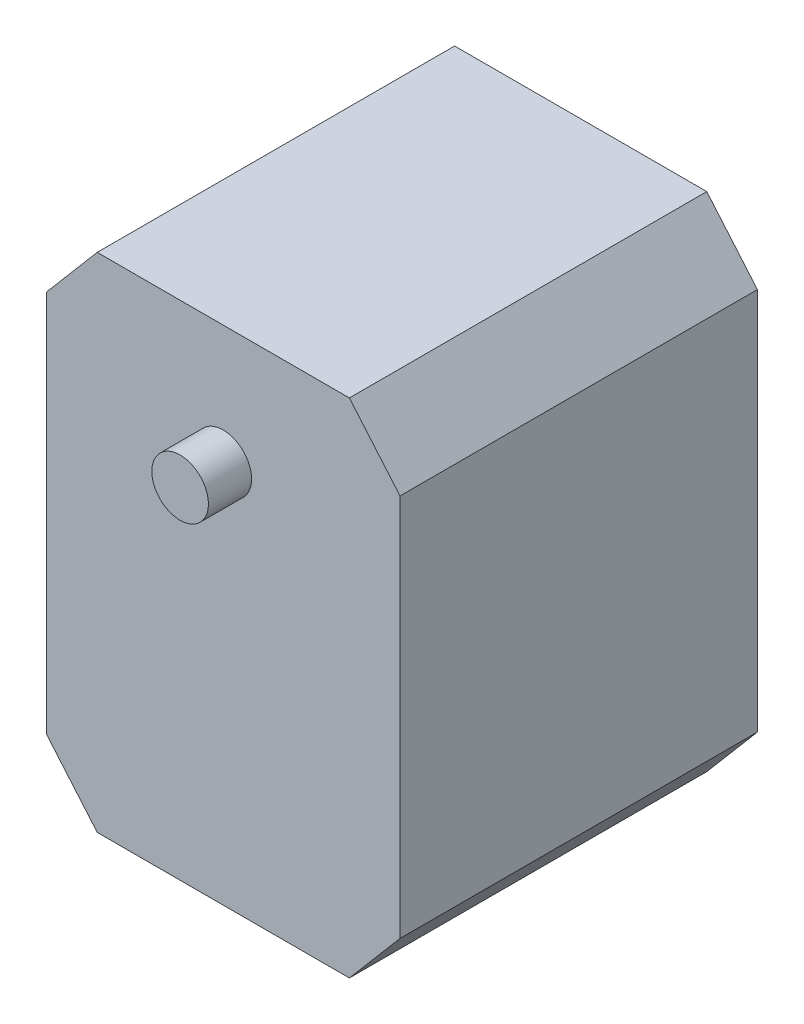
ISO-10303-21;
HEADER;
FILE_DESCRIPTION(('STEP AP214'),'2;1');
FILE_NAME('part.step','',(''),(''),'','','');
FILE_SCHEMA(('AUTOMOTIVE_DESIGN { 1 0 10303 214 1 1 1 1 }'));
ENDSEC;
DATA;
#1=APPLICATION_CONTEXT('core data for automotive mechanical design processes');
#2=APPLICATION_PROTOCOL_DEFINITION('international standard','automotive_design',2000,#1);
#3=PRODUCT_CONTEXT('',#1,'mechanical');
#4=PRODUCT('Part','Part','',(#3));
#5=PRODUCT_RELATED_PRODUCT_CATEGORY('part','',(#4));
#6=PRODUCT_DEFINITION_FORMATION('','',#4);
#7=PRODUCT_DEFINITION_CONTEXT('part definition',#1,'design');
#8=PRODUCT_DEFINITION('design','',#6,#7);
#9=PRODUCT_DEFINITION_SHAPE('','',#8);
#10=(LENGTH_UNIT() NAMED_UNIT(*) SI_UNIT(.MILLI.,.METRE.));
#11=(NAMED_UNIT(*) PLANE_ANGLE_UNIT() SI_UNIT($,.RADIAN.));
#12=(NAMED_UNIT(*) SI_UNIT($,.STERADIAN.) SOLID_ANGLE_UNIT());
#13=UNCERTAINTY_MEASURE_WITH_UNIT(LENGTH_MEASURE(1.E-05),#10,'distance_accuracy_value','');
#14=(GEOMETRIC_REPRESENTATION_CONTEXT(3) GLOBAL_UNCERTAINTY_ASSIGNED_CONTEXT((#13)) GLOBAL_UNIT_ASSIGNED_CONTEXT((#10,
#11,#12)) REPRESENTATION_CONTEXT('',''));
#15=CARTESIAN_POINT('',(0.,0.,0.));
#16=DIRECTION('',(0.,0.,1.));
#17=DIRECTION('',(1.,0.,0.));
#18=AXIS2_PLACEMENT_3D('',#15,#16,#17);
#19=CARTESIAN_POINT('',(0.,0.,-17.75));
#20=DIRECTION('',(0.,0.,1.));
#21=DIRECTION('',(1.,0.,0.));
#22=AXIS2_PLACEMENT_3D('',#19,#20,#21);
#23=PLANE('',#22);
#24=CARTESIAN_POINT('',(0.,0.,-17.75));
#25=DIRECTION('',(0.,0.,1.));
#26=DIRECTION('',(1.,0.,0.));
#27=AXIS2_PLACEMENT_3D('',#24,#25,#26);
#28=CIRCLE('',#27,1.6);
#29=CARTESIAN_POINT('',(1.6,0.,-17.75));
#30=VERTEX_POINT('',#29);
#31=EDGE_CURVE('E11',#30,#30,#28,.F.);
#32=ORIENTED_EDGE('',*,*,#31,.T.);
#33=EDGE_LOOP('',(#32));
#34=FACE_BOUND('',#33,.T.);
#35=ADVANCED_FACE('F37',(#34),#23,.F.);
#36=CARTESIAN_POINT('',(0.,0.,-20.2125));
#37=DIRECTION('',(0.,0.,1.));
#38=DIRECTION('',(1.,0.,0.));
#39=AXIS2_PLACEMENT_3D('',#36,#37,#38);
#40=CYLINDRICAL_SURFACE('',#39,1.6);
#41=CARTESIAN_POINT('',(0.,0.,-19.25));
#42=DIRECTION('',(0.,0.,1.));
#43=DIRECTION('',(1.,0.,0.));
#44=AXIS2_PLACEMENT_3D('',#41,#42,#43);
#45=CIRCLE('',#44,1.6);
#46=CARTESIAN_POINT('',(1.6,0.,-19.25));
#47=VERTEX_POINT('',#46);
#48=EDGE_CURVE('E162',#47,#47,#45,.T.);
#49=ORIENTED_EDGE('',*,*,#48,.F.);
#50=EDGE_LOOP('',(#49));
#51=FACE_BOUND('',#50,.T.);
#52=ORIENTED_EDGE('',*,*,#31,.F.);
#53=EDGE_LOOP('',(#52));
#54=FACE_BOUND('',#53,.T.);
#55=ADVANCED_FACE('F39',(#51,#54),#40,.F.);
#56=CARTESIAN_POINT('',(0.,0.,0.9625));
#57=DIRECTION('',(0.,0.,-1.));
#58=DIRECTION('',(-1.,0.,0.));
#59=AXIS2_PLACEMENT_3D('',#56,#57,#58);
#60=CYLINDRICAL_SURFACE('',#59,3.);
#61=CARTESIAN_POINT('',(0.,0.,-19.25));
#62=DIRECTION('',(0.,0.,-1.));
#63=DIRECTION('',(-1.,0.,0.));
#64=AXIS2_PLACEMENT_3D('',#61,#62,#63);
#65=CIRCLE('',#64,3.);
#66=CARTESIAN_POINT('',(-3.,0.,-19.25));
#67=VERTEX_POINT('',#66);
#68=EDGE_CURVE('E119',#67,#67,#65,.F.);
#69=ORIENTED_EDGE('',*,*,#68,.T.);
#70=EDGE_LOOP('',(#69));
#71=FACE_BOUND('',#70,.T.);
#72=CARTESIAN_POINT('',(0.,0.,-17.75));
#73=DIRECTION('',(0.,0.,1.));
#74=DIRECTION('',(1.,0.,0.));
#75=AXIS2_PLACEMENT_3D('',#72,#73,#74);
#76=CIRCLE('',#75,3.);
#77=CARTESIAN_POINT('',(3.,0.,-17.75));
#78=VERTEX_POINT('',#77);
#79=EDGE_CURVE('E138',#78,#78,#76,.F.);
#80=ORIENTED_EDGE('',*,*,#79,.T.);
#81=EDGE_LOOP('',(#80));
#82=FACE_BOUND('',#81,.T.);
#83=ADVANCED_FACE('F202',(#71,#82),#60,.T.);
#84=CARTESIAN_POINT('',(0.,0.,-19.25));
#85=DIRECTION('',(0.,0.,-1.));
#86=DIRECTION('',(-1.,0.,0.));
#87=AXIS2_PLACEMENT_3D('',#84,#85,#86);
#88=PLANE('',#87);
#89=ORIENTED_EDGE('',*,*,#48,.T.);
#90=EDGE_LOOP('',(#89));
#91=FACE_BOUND('',#90,.T.);
#92=ORIENTED_EDGE('',*,*,#68,.F.);
#93=EDGE_LOOP('',(#92));
#94=FACE_BOUND('',#93,.T.);
#95=ADVANCED_FACE('F197',(#91,#94),#88,.T.);
#96=DIRECTION('',(1.,-1.90121568558025E-12,0.));
#97=VECTOR('',#96,1.);
#98=CARTESIAN_POINT('',(-6.22665484517751,12.0000000000011,-17.75));
#99=LINE('',#98,#97);
#100=CARTESIAN_POINT('',(-12.7,12.,-17.75));
#101=VERTEX_POINT('',#100);
#102=CARTESIAN_POINT('',(12.7,12.,-17.75));
#103=VERTEX_POINT('',#102);
#104=EDGE_CURVE('E157',#101,#103,#99,.T.);
#105=ORIENTED_EDGE('',*,*,#104,.T.);
#106=DIRECTION('',(0.647648420095541,-0.761939317759459,0.));
#107=VECTOR('',#106,1.);
#108=CARTESIAN_POINT('',(17.8,6.,-17.75));
#109=LINE('',#108,#107);
#110=CARTESIAN_POINT('',(17.8,6.,-17.75));
#111=VERTEX_POINT('',#110);
#112=EDGE_CURVE('E139',#103,#111,#109,.T.);
#113=ORIENTED_EDGE('',*,*,#112,.T.);
#114=DIRECTION('',(0.,-1.,0.));
#115=VECTOR('',#114,1.);
#116=CARTESIAN_POINT('',(17.8,-32.6,-17.75));
#117=LINE('',#116,#115);
#118=CARTESIAN_POINT('',(17.8,-32.6,-17.75));
#119=VERTEX_POINT('',#118);
#120=EDGE_CURVE('E142',#111,#119,#117,.T.);
#121=ORIENTED_EDGE('',*,*,#120,.T.);
#122=DIRECTION('',(-0.647648420095541,-0.761939317759459,0.));
#123=VECTOR('',#122,1.);
#124=CARTESIAN_POINT('',(12.7,-38.6,-17.75));
#125=LINE('',#124,#123);
#126=CARTESIAN_POINT('',(12.7,-38.6,-17.75));
#127=VERTEX_POINT('',#126);
#128=EDGE_CURVE('E145',#119,#127,#125,.T.);
#129=ORIENTED_EDGE('',*,*,#128,.T.);
#130=DIRECTION('',(-1.,0.,0.));
#131=VECTOR('',#130,1.);
#132=CARTESIAN_POINT('',(-12.7,-38.6,-17.75));
#133=LINE('',#132,#131);
#134=CARTESIAN_POINT('',(-12.7,-38.6,-17.75));
#135=VERTEX_POINT('',#134);
#136=EDGE_CURVE('E148',#127,#135,#133,.T.);
#137=ORIENTED_EDGE('',*,*,#136,.T.);
#138=DIRECTION('',(-0.647648420095541,0.761939317759459,0.));
#139=VECTOR('',#138,1.);
#140=CARTESIAN_POINT('',(-17.8,-32.6,-17.75));
#141=LINE('',#140,#139);
#142=CARTESIAN_POINT('',(-17.8,-32.6,-17.75));
#143=VERTEX_POINT('',#142);
#144=EDGE_CURVE('E151',#135,#143,#141,.T.);
#145=ORIENTED_EDGE('',*,*,#144,.T.);
#146=DIRECTION('',(0.,1.,0.));
#147=VECTOR('',#146,1.);
#148=CARTESIAN_POINT('',(-17.7999999999999,5.9999999999999,-17.75));
#149=LINE('',#148,#147);
#150=CARTESIAN_POINT('',(-17.7999999999999,5.9999999999999,-17.75));
#151=VERTEX_POINT('',#150);
#152=EDGE_CURVE('E113',#143,#151,#149,.T.);
#153=ORIENTED_EDGE('',*,*,#152,.T.);
#154=DIRECTION('',(0.647648420095526,0.761939317759472,0.));
#155=VECTOR('',#154,1.);
#156=CARTESIAN_POINT('',(-12.7,12.,-17.75));
#157=LINE('',#156,#155);
#158=EDGE_CURVE('E154',#151,#101,#157,.T.);
#159=ORIENTED_EDGE('',*,*,#158,.T.);
#160=EDGE_LOOP('',(#105,#113,#121,#129,#137,#145,#153,#159));
#161=FACE_BOUND('',#160,.T.);
#162=ORIENTED_EDGE('',*,*,#79,.F.);
#163=EDGE_LOOP('',(#162));
#164=FACE_BOUND('',#163,.T.);
#165=ADVANCED_FACE('F207',(#161,#164),#23,.F.);
#166=CARTESIAN_POINT('',(12.2,12.,-17.75));
#167=DIRECTION('',(0.,1.,0.));
#168=DIRECTION('',(0.,0.,1.));
#169=AXIS2_PLACEMENT_3D('',#166,#167,#168);
#170=PLANE('',#169);
#171=ORIENTED_EDGE('',*,*,#104,.F.);
#172=DIRECTION('',(0.,0.,1.));
#173=VECTOR('',#172,1.);
#174=CARTESIAN_POINT('',(-12.7,12.,-17.75));
#175=LINE('',#174,#173);
#176=CARTESIAN_POINT('',(-12.7,12.,18.25));
#177=VERTEX_POINT('',#176);
#178=EDGE_CURVE('E55',#101,#177,#175,.T.);
#179=ORIENTED_EDGE('',*,*,#178,.T.);
#180=DIRECTION('',(1.,0.,0.));
#181=VECTOR('',#180,1.);
#182=CARTESIAN_POINT('',(5.65,12.,18.25));
#183=LINE('',#182,#181);
#184=CARTESIAN_POINT('',(12.7,12.,18.25));
#185=VERTEX_POINT('',#184);
#186=EDGE_CURVE('E160',#177,#185,#183,.T.);
#187=ORIENTED_EDGE('',*,*,#186,.T.);
#188=DIRECTION('',(0.,0.,1.));
#189=VECTOR('',#188,1.);
#190=CARTESIAN_POINT('',(12.7,12.,-17.75));
#191=LINE('',#190,#189);
#192=EDGE_CURVE('E95',#185,#103,#191,.F.);
#193=ORIENTED_EDGE('',*,*,#192,.T.);
#194=EDGE_LOOP('',(#171,#179,#187,#193));
#195=FACE_BOUND('',#194,.T.);
#196=ADVANCED_FACE('F214',(#195),#170,.T.);
#197=CARTESIAN_POINT('',(17.8,-32.6,13.));
#198=DIRECTION('',(1.,0.,0.));
#199=DIRECTION('',(0.,0.,-1.));
#200=AXIS2_PLACEMENT_3D('',#197,#198,#199);
#201=PLANE('',#200);
#202=DIRECTION('',(0.,0.,1.));
#203=VECTOR('',#202,1.);
#204=CARTESIAN_POINT('',(17.8,6.,-13.));
#205=LINE('',#204,#203);
#206=CARTESIAN_POINT('',(17.8,6.,18.25));
#207=VERTEX_POINT('',#206);
#208=EDGE_CURVE('E169',#111,#207,#205,.T.);
#209=ORIENTED_EDGE('',*,*,#208,.T.);
#210=DIRECTION('',(0.,-1.,0.));
#211=VECTOR('',#210,1.);
#212=CARTESIAN_POINT('',(17.8,-32.6,18.25));
#213=LINE('',#212,#211);
#214=CARTESIAN_POINT('',(17.8,-32.6,18.25));
#215=VERTEX_POINT('',#214);
#216=EDGE_CURVE('E499',#207,#215,#213,.T.);
#217=ORIENTED_EDGE('',*,*,#216,.T.);
#218=DIRECTION('',(0.,0.,-1.));
#219=VECTOR('',#218,1.);
#220=CARTESIAN_POINT('',(17.8,-32.6,13.));
#221=LINE('',#220,#219);
#222=EDGE_CURVE('E172',#215,#119,#221,.T.);
#223=ORIENTED_EDGE('',*,*,#222,.T.);
#224=ORIENTED_EDGE('',*,*,#120,.F.);
#225=EDGE_LOOP('',(#209,#217,#223,#224));
#226=FACE_BOUND('',#225,.T.);
#227=ADVANCED_FACE('F219',(#226),#201,.T.);
#228=CARTESIAN_POINT('',(12.7,-38.6,13.));
#229=DIRECTION('',(0.761939317759496,-0.647648420095497,0.));
#230=DIRECTION('',(0.647648420095497,0.761939317759496,0.));
#231=AXIS2_PLACEMENT_3D('',#228,#229,#230);
#232=PLANE('',#231);
#233=ORIENTED_EDGE('',*,*,#128,.F.);
#234=ORIENTED_EDGE('',*,*,#222,.F.);
#235=DIRECTION('',(-0.647648420095541,-0.761939317759459,0.));
#236=VECTOR('',#235,1.);
#237=CARTESIAN_POINT('',(12.7,-38.6,18.25));
#238=LINE('',#237,#236);
#239=CARTESIAN_POINT('',(12.7,-38.6,18.25));
#240=VERTEX_POINT('',#239);
#241=EDGE_CURVE('E133',#215,#240,#238,.T.);
#242=ORIENTED_EDGE('',*,*,#241,.T.);
#243=DIRECTION('',(0.,0.,1.));
#244=VECTOR('',#243,1.);
#245=CARTESIAN_POINT('',(12.7,-38.6,13.));
#246=LINE('',#245,#244);
#247=EDGE_CURVE('E174',#240,#127,#246,.F.);
#248=ORIENTED_EDGE('',*,*,#247,.T.);
#249=EDGE_LOOP('',(#233,#234,#242,#248));
#250=FACE_BOUND('',#249,.T.);
#251=ADVANCED_FACE('F254',(#250),#232,.T.);
#252=CARTESIAN_POINT('',(-12.7,-38.6,13.));
#253=DIRECTION('',(0.,-1.,0.));
#254=DIRECTION('',(0.,0.,-1.));
#255=AXIS2_PLACEMENT_3D('',#252,#253,#254);
#256=PLANE('',#255);
#257=ORIENTED_EDGE('',*,*,#136,.F.);
#258=ORIENTED_EDGE('',*,*,#247,.F.);
#259=DIRECTION('',(-1.,0.,0.));
#260=VECTOR('',#259,1.);
#261=CARTESIAN_POINT('',(-12.7,-38.6,18.25));
#262=LINE('',#261,#260);
#263=CARTESIAN_POINT('',(-12.7,-38.6,18.25));
#264=VERTEX_POINT('',#263);
#265=EDGE_CURVE('E131',#240,#264,#262,.T.);
#266=ORIENTED_EDGE('',*,*,#265,.T.);
#267=DIRECTION('',(0.,0.,-1.));
#268=VECTOR('',#267,1.);
#269=CARTESIAN_POINT('',(-12.7,-38.6,13.));
#270=LINE('',#269,#268);
#271=EDGE_CURVE('E118',#264,#135,#270,.T.);
#272=ORIENTED_EDGE('',*,*,#271,.T.);
#273=EDGE_LOOP('',(#257,#258,#266,#272));
#274=FACE_BOUND('',#273,.T.);
#275=ADVANCED_FACE('F265',(#274),#256,.T.);
#276=CARTESIAN_POINT('',(-17.8,-32.6,13.));
#277=DIRECTION('',(-0.761939317759496,-0.647648420095497,0.));
#278=DIRECTION('',(0.647648420095497,-0.761939317759496,0.));
#279=AXIS2_PLACEMENT_3D('',#276,#277,#278);
#280=PLANE('',#279);
#281=DIRECTION('',(0.,0.,1.));
#282=VECTOR('',#281,1.);
#283=CARTESIAN_POINT('',(-17.8,-32.6,13.));
#284=LINE('',#283,#282);
#285=CARTESIAN_POINT('',(-17.8,-32.6,18.25));
#286=VERTEX_POINT('',#285);
#287=EDGE_CURVE('E108',#286,#143,#284,.F.);
#288=ORIENTED_EDGE('',*,*,#287,.T.);
#289=ORIENTED_EDGE('',*,*,#144,.F.);
#290=ORIENTED_EDGE('',*,*,#271,.F.);
#291=DIRECTION('',(-0.647648420095541,0.761939317759459,0.));
#292=VECTOR('',#291,1.);
#293=CARTESIAN_POINT('',(-17.8,-32.6,18.25));
#294=LINE('',#293,#292);
#295=EDGE_CURVE('E126',#264,#286,#294,.T.);
#296=ORIENTED_EDGE('',*,*,#295,.T.);
#297=EDGE_LOOP('',(#288,#289,#290,#296));
#298=FACE_BOUND('',#297,.T.);
#299=ADVANCED_FACE('F130',(#298),#280,.T.);
#300=CARTESIAN_POINT('',(-17.8,6.,13.));
#301=DIRECTION('',(-1.,0.,0.));
#302=DIRECTION('',(0.,0.,1.));
#303=AXIS2_PLACEMENT_3D('',#300,#301,#302);
#304=PLANE('',#303);
#305=ORIENTED_EDGE('',*,*,#152,.F.);
#306=ORIENTED_EDGE('',*,*,#287,.F.);
#307=DIRECTION('',(0.,1.,0.));
#308=VECTOR('',#307,1.);
#309=CARTESIAN_POINT('',(-17.7999999999999,5.9999999999999,18.25));
#310=LINE('',#309,#308);
#311=CARTESIAN_POINT('',(-17.7999999999999,5.9999999999999,18.25));
#312=VERTEX_POINT('',#311);
#313=EDGE_CURVE('E111',#286,#312,#310,.T.);
#314=ORIENTED_EDGE('',*,*,#313,.T.);
#315=DIRECTION('',(0.,0.,1.));
#316=VECTOR('',#315,1.);
#317=CARTESIAN_POINT('',(-17.7999999999997,5.99999999999971,13.));
#318=LINE('',#317,#316);
#319=EDGE_CURVE('E84',#151,#312,#318,.T.);
#320=ORIENTED_EDGE('',*,*,#319,.F.);
#321=EDGE_LOOP('',(#305,#306,#314,#320));
#322=FACE_BOUND('',#321,.T.);
#323=ADVANCED_FACE('F110',(#322),#304,.T.);
#324=CARTESIAN_POINT('',(-12.7,12.,13.));
#325=DIRECTION('',(-0.761939317759496,0.647648420095497,0.));
#326=DIRECTION('',(-0.647648420095497,-0.761939317759496,0.));
#327=AXIS2_PLACEMENT_3D('',#324,#325,#326);
#328=PLANE('',#327);
#329=ORIENTED_EDGE('',*,*,#158,.F.);
#330=ORIENTED_EDGE('',*,*,#319,.T.);
#331=DIRECTION('',(0.647648420095526,0.761939317759472,0.));
#332=VECTOR('',#331,1.);
#333=CARTESIAN_POINT('',(-12.7,12.,18.25));
#334=LINE('',#333,#332);
#335=EDGE_CURVE('E128',#312,#177,#334,.T.);
#336=ORIENTED_EDGE('',*,*,#335,.T.);
#337=ORIENTED_EDGE('',*,*,#178,.F.);
#338=EDGE_LOOP('',(#329,#330,#336,#337));
#339=FACE_BOUND('',#338,.T.);
#340=ADVANCED_FACE('F295',(#339),#328,.T.);
#341=CARTESIAN_POINT('',(17.8,6.,-13.));
#342=DIRECTION('',(-0.761939317759496,-0.647648420095497,0.));
#343=DIRECTION('',(0.647648420095497,-0.761939317759496,0.));
#344=AXIS2_PLACEMENT_3D('',#341,#342,#343);
#345=PLANE('',#344);
#346=DIRECTION('',(0.647648420095541,-0.761939317759459,0.));
#347=VECTOR('',#346,1.);
#348=CARTESIAN_POINT('',(17.8,6.,18.25));
#349=LINE('',#348,#347);
#350=EDGE_CURVE('E496',#185,#207,#349,.T.);
#351=ORIENTED_EDGE('',*,*,#350,.T.);
#352=ORIENTED_EDGE('',*,*,#208,.F.);
#353=ORIENTED_EDGE('',*,*,#112,.F.);
#354=ORIENTED_EDGE('',*,*,#192,.F.);
#355=EDGE_LOOP('',(#351,#352,#353,#354));
#356=FACE_BOUND('',#355,.T.);
#357=ADVANCED_FACE('F304',(#356),#345,.F.);
#358=CARTESIAN_POINT('',(0.,0.,18.25));
#359=DIRECTION('',(0.,0.,1.));
#360=DIRECTION('',(1.,0.,0.));
#361=AXIS2_PLACEMENT_3D('',#358,#359,#360);
#362=PLANE('',#361);
#363=CARTESIAN_POINT('',(0.,0.,18.25));
#364=DIRECTION('',(0.,0.,1.));
#365=DIRECTION('',(1.,0.,0.));
#366=AXIS2_PLACEMENT_3D('',#363,#364,#365);
#367=CIRCLE('',#366,2.85);
#368=CARTESIAN_POINT('',(2.85,0.,18.25));
#369=VERTEX_POINT('',#368);
#370=EDGE_CURVE('E41',#369,#369,#367,.F.);
#371=ORIENTED_EDGE('',*,*,#370,.T.);
#372=EDGE_LOOP('',(#371));
#373=FACE_BOUND('',#372,.T.);
#374=ORIENTED_EDGE('',*,*,#186,.F.);
#375=ORIENTED_EDGE('',*,*,#335,.F.);
#376=ORIENTED_EDGE('',*,*,#313,.F.);
#377=ORIENTED_EDGE('',*,*,#295,.F.);
#378=ORIENTED_EDGE('',*,*,#265,.F.);
#379=ORIENTED_EDGE('',*,*,#241,.F.);
#380=ORIENTED_EDGE('',*,*,#216,.F.);
#381=ORIENTED_EDGE('',*,*,#350,.F.);
#382=EDGE_LOOP('',(#374,#375,#376,#377,#378,#379,#380,#381));
#383=FACE_BOUND('',#382,.T.);
#384=ADVANCED_FACE('F124',(#373,#383),#362,.T.);
#385=CARTESIAN_POINT('',(0.,0.,22.6));
#386=DIRECTION('',(0.,0.,1.));
#387=DIRECTION('',(1.,0.,0.));
#388=AXIS2_PLACEMENT_3D('',#385,#386,#387);
#389=PLANE('',#388);
#390=CARTESIAN_POINT('',(0.,0.,22.6));
#391=DIRECTION('',(0.,0.,1.));
#392=DIRECTION('',(1.,0.,0.));
#393=AXIS2_PLACEMENT_3D('',#390,#391,#392);
#394=CIRCLE('',#393,2.85);
#395=CARTESIAN_POINT('',(2.85,0.,22.6));
#396=VERTEX_POINT('',#395);
#397=EDGE_CURVE('E165',#396,#396,#394,.F.);
#398=ORIENTED_EDGE('',*,*,#397,.F.);
#399=EDGE_LOOP('',(#398));
#400=FACE_BOUND('',#399,.T.);
#401=ADVANCED_FACE('F323',(#400),#389,.T.);
#402=CARTESIAN_POINT('',(0.,0.,17.75));
#403=DIRECTION('',(0.,0.,1.));
#404=DIRECTION('',(1.,0.,0.));
#405=AXIS2_PLACEMENT_3D('',#402,#403,#404);
#406=CYLINDRICAL_SURFACE('',#405,2.85);
#407=ORIENTED_EDGE('',*,*,#370,.F.);
#408=EDGE_LOOP('',(#407));
#409=FACE_BOUND('',#408,.T.);
#410=ORIENTED_EDGE('',*,*,#397,.T.);
#411=EDGE_LOOP('',(#410));
#412=FACE_BOUND('',#411,.T.);
#413=ADVANCED_FACE('F329',(#409,#412),#406,.T.);
#414=CLOSED_SHELL('',(#35,#55,#83,#95,#165,#196,#227,#251,#275,#299,#323,#340,#357,#384,#401,#413));
#415=MANIFOLD_SOLID_BREP('B2',#414);
#416=ADVANCED_BREP_SHAPE_REPRESENTATION('',(#18,#415),#14);
#417=SHAPE_DEFINITION_REPRESENTATION(#9,#416);
ENDSEC;
END-ISO-10303-21;
